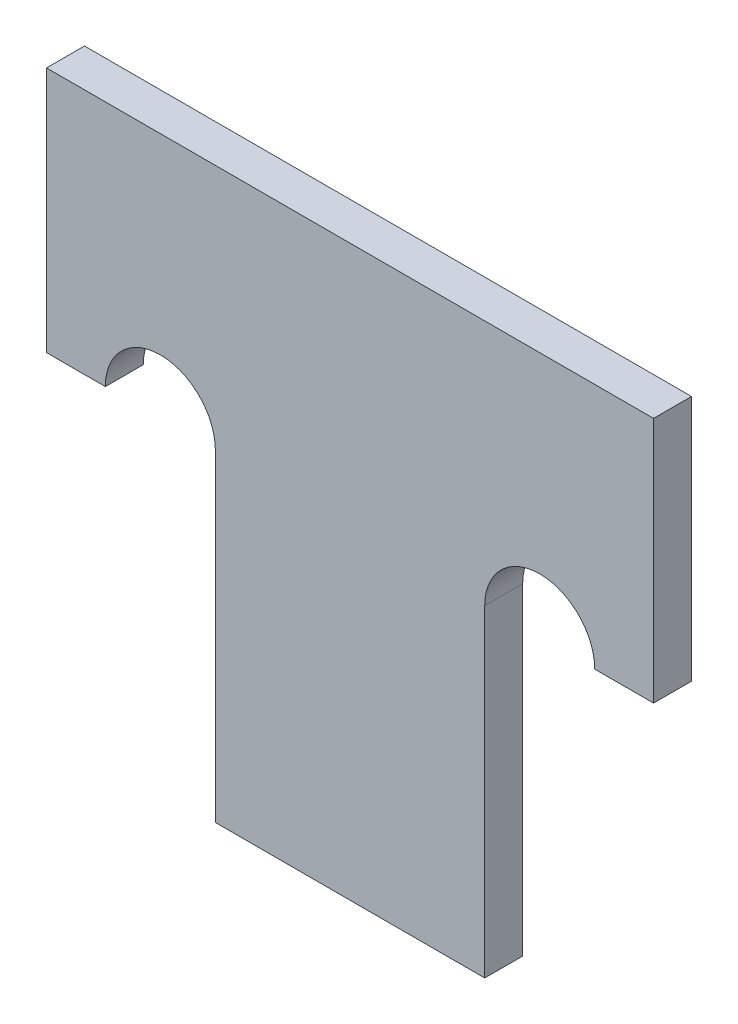
ISO-10303-21;
HEADER;
FILE_DESCRIPTION(('STEP AP214'),'2;1');
FILE_NAME('part.step','',(''),(''),'','','');
FILE_SCHEMA(('AUTOMOTIVE_DESIGN { 1 0 10303 214 1 1 1 1 }'));
ENDSEC;
DATA;
#1=APPLICATION_CONTEXT('core data for automotive mechanical design processes');
#2=APPLICATION_PROTOCOL_DEFINITION('international standard','automotive_design',2000,#1);
#3=PRODUCT_CONTEXT('',#1,'mechanical');
#4=PRODUCT('Part','Part','',(#3));
#5=PRODUCT_RELATED_PRODUCT_CATEGORY('part','',(#4));
#6=PRODUCT_DEFINITION_FORMATION('','',#4);
#7=PRODUCT_DEFINITION_CONTEXT('part definition',#1,'design');
#8=PRODUCT_DEFINITION('design','',#6,#7);
#9=PRODUCT_DEFINITION_SHAPE('','',#8);
#10=(LENGTH_UNIT() NAMED_UNIT(*) SI_UNIT(.MILLI.,.METRE.));
#11=(NAMED_UNIT(*) PLANE_ANGLE_UNIT() SI_UNIT($,.RADIAN.));
#12=(NAMED_UNIT(*) SI_UNIT($,.STERADIAN.) SOLID_ANGLE_UNIT());
#13=UNCERTAINTY_MEASURE_WITH_UNIT(LENGTH_MEASURE(1.E-05),#10,'distance_accuracy_value','');
#14=(GEOMETRIC_REPRESENTATION_CONTEXT(3) GLOBAL_UNCERTAINTY_ASSIGNED_CONTEXT((#13)) GLOBAL_UNIT_ASSIGNED_CONTEXT((#10,
#11,#12)) REPRESENTATION_CONTEXT('',''));
#15=CARTESIAN_POINT('',(0.,0.,0.));
#16=DIRECTION('',(0.,0.,1.));
#17=DIRECTION('',(1.,0.,0.));
#18=AXIS2_PLACEMENT_3D('',#15,#16,#17);
#19=CARTESIAN_POINT('',(0.,0.,2.54));
#20=DIRECTION('',(0.,0.,-1.));
#21=DIRECTION('',(-1.,0.,0.));
#22=AXIS2_PLACEMENT_3D('',#19,#20,#21);
#23=PLANE('',#22);
#24=DIRECTION('',(1.,0.,0.));
#25=VECTOR('',#24,1.);
#26=CARTESIAN_POINT('',(16.383,2.54,2.54));
#27=LINE('',#26,#25);
#28=CARTESIAN_POINT('',(16.383,2.54,2.54));
#29=VERTEX_POINT('',#28);
#30=CARTESIAN_POINT('',(20.32,2.54,2.54));
#31=VERTEX_POINT('',#30);
#32=EDGE_CURVE('E122',#29,#31,#27,.T.);
#33=ORIENTED_EDGE('',*,*,#32,.T.);
#34=DIRECTION('',(0.,1.,0.));
#35=VECTOR('',#34,1.);
#36=CARTESIAN_POINT('',(20.32,-19.05,2.54));
#37=LINE('',#36,#35);
#38=CARTESIAN_POINT('',(20.32,19.05,2.54));
#39=VERTEX_POINT('',#38);
#40=EDGE_CURVE('E172',#31,#39,#37,.T.);
#41=ORIENTED_EDGE('',*,*,#40,.T.);
#42=DIRECTION('',(-1.,0.,0.));
#43=VECTOR('',#42,1.);
#44=CARTESIAN_POINT('',(-20.32,19.05,2.54));
#45=LINE('',#44,#43);
#46=CARTESIAN_POINT('',(-20.32,19.05,2.54));
#47=VERTEX_POINT('',#46);
#48=EDGE_CURVE('E174',#39,#47,#45,.T.);
#49=ORIENTED_EDGE('',*,*,#48,.T.);
#50=DIRECTION('',(0.,-1.,0.));
#51=VECTOR('',#50,1.);
#52=CARTESIAN_POINT('',(-20.32,-19.05,2.54));
#53=LINE('',#52,#51);
#54=CARTESIAN_POINT('',(-20.32,2.54,2.54));
#55=VERTEX_POINT('',#54);
#56=EDGE_CURVE('E177',#47,#55,#53,.T.);
#57=ORIENTED_EDGE('',*,*,#56,.T.);
#58=DIRECTION('',(1.,0.,0.));
#59=VECTOR('',#58,1.);
#60=CARTESIAN_POINT('',(-16.383,2.54,2.54));
#61=LINE('',#60,#59);
#62=CARTESIAN_POINT('',(-16.383,2.54,2.54));
#63=VERTEX_POINT('',#62);
#64=EDGE_CURVE('E153',#55,#63,#61,.T.);
#65=ORIENTED_EDGE('',*,*,#64,.T.);
#66=CARTESIAN_POINT('',(-12.7,2.54,2.54));
#67=DIRECTION('',(0.,0.,-1.));
#68=DIRECTION('',(-1.,0.,0.));
#69=AXIS2_PLACEMENT_3D('',#66,#67,#68);
#70=CIRCLE('',#69,3.683);
#71=CARTESIAN_POINT('',(-9.017,2.54,2.54));
#72=VERTEX_POINT('',#71);
#73=EDGE_CURVE('E138',#63,#72,#70,.T.);
#74=ORIENTED_EDGE('',*,*,#73,.T.);
#75=DIRECTION('',(0.,-1.,0.));
#76=VECTOR('',#75,1.);
#77=CARTESIAN_POINT('',(-9.017,2.54,2.54));
#78=LINE('',#77,#76);
#79=CARTESIAN_POINT('',(-9.017,-19.05,2.54));
#80=VERTEX_POINT('',#79);
#81=EDGE_CURVE('E135',#72,#80,#78,.T.);
#82=ORIENTED_EDGE('',*,*,#81,.T.);
#83=DIRECTION('',(1.,0.,0.));
#84=VECTOR('',#83,1.);
#85=CARTESIAN_POINT('',(-20.32,-19.05,2.54));
#86=LINE('',#85,#84);
#87=CARTESIAN_POINT('',(9.017,-19.05,2.54));
#88=VERTEX_POINT('',#87);
#89=EDGE_CURVE('E180',#80,#88,#86,.T.);
#90=ORIENTED_EDGE('',*,*,#89,.T.);
#91=DIRECTION('',(0.,1.,0.));
#92=VECTOR('',#91,1.);
#93=CARTESIAN_POINT('',(9.017,2.54,2.54));
#94=LINE('',#93,#92);
#95=CARTESIAN_POINT('',(9.017,2.54,2.54));
#96=VERTEX_POINT('',#95);
#97=EDGE_CURVE('E51',#88,#96,#94,.T.);
#98=ORIENTED_EDGE('',*,*,#97,.T.);
#99=CARTESIAN_POINT('',(12.7,2.54,2.54));
#100=DIRECTION('',(0.,0.,-1.));
#101=DIRECTION('',(-1.,0.,0.));
#102=AXIS2_PLACEMENT_3D('',#99,#100,#101);
#103=CIRCLE('',#102,3.683);
#104=EDGE_CURVE('E121',#96,#29,#103,.T.);
#105=ORIENTED_EDGE('',*,*,#104,.T.);
#106=EDGE_LOOP('',(#33,#41,#49,#57,#65,#74,#82,#90,#98,#105));
#107=FACE_BOUND('',#106,.T.);
#108=ADVANCED_FACE('F36',(#107),#23,.F.);
#109=CARTESIAN_POINT('',(0.,0.,0.));
#110=DIRECTION('',(0.,0.,-1.));
#111=DIRECTION('',(-1.,0.,0.));
#112=AXIS2_PLACEMENT_3D('',#109,#110,#111);
#113=PLANE('',#112);
#114=DIRECTION('',(0.,1.,0.));
#115=VECTOR('',#114,1.);
#116=CARTESIAN_POINT('',(20.32,-19.05,0.));
#117=LINE('',#116,#115);
#118=CARTESIAN_POINT('',(20.32,2.54,0.));
#119=VERTEX_POINT('',#118);
#120=CARTESIAN_POINT('',(20.32,19.05,0.));
#121=VERTEX_POINT('',#120);
#122=EDGE_CURVE('E183',#119,#121,#117,.T.);
#123=ORIENTED_EDGE('',*,*,#122,.F.);
#124=DIRECTION('',(-1.,0.,0.));
#125=VECTOR('',#124,1.);
#126=CARTESIAN_POINT('',(16.383,2.54,0.));
#127=LINE('',#126,#125);
#128=CARTESIAN_POINT('',(16.383,2.54,0.));
#129=VERTEX_POINT('',#128);
#130=EDGE_CURVE('E131',#119,#129,#127,.T.);
#131=ORIENTED_EDGE('',*,*,#130,.T.);
#132=CARTESIAN_POINT('',(12.7,2.54,0.));
#133=DIRECTION('',(0.,0.,1.));
#134=DIRECTION('',(1.,0.,0.));
#135=AXIS2_PLACEMENT_3D('',#132,#133,#134);
#136=CIRCLE('',#135,3.683);
#137=CARTESIAN_POINT('',(9.017,2.54,0.));
#138=VERTEX_POINT('',#137);
#139=EDGE_CURVE('E118',#129,#138,#136,.T.);
#140=ORIENTED_EDGE('',*,*,#139,.T.);
#141=DIRECTION('',(0.,-1.,0.));
#142=VECTOR('',#141,1.);
#143=CARTESIAN_POINT('',(9.017,2.54,0.));
#144=LINE('',#143,#142);
#145=CARTESIAN_POINT('',(9.017,-19.05,0.));
#146=VERTEX_POINT('',#145);
#147=EDGE_CURVE('E126',#138,#146,#144,.T.);
#148=ORIENTED_EDGE('',*,*,#147,.T.);
#149=DIRECTION('',(1.,0.,0.));
#150=VECTOR('',#149,1.);
#151=CARTESIAN_POINT('',(-20.32,-19.05,0.));
#152=LINE('',#151,#150);
#153=CARTESIAN_POINT('',(-9.017,-19.05,0.));
#154=VERTEX_POINT('',#153);
#155=EDGE_CURVE('E175',#154,#146,#152,.T.);
#156=ORIENTED_EDGE('',*,*,#155,.F.);
#157=DIRECTION('',(0.,1.,0.));
#158=VECTOR('',#157,1.);
#159=CARTESIAN_POINT('',(-9.017,2.54,0.));
#160=LINE('',#159,#158);
#161=CARTESIAN_POINT('',(-9.017,2.54,0.));
#162=VERTEX_POINT('',#161);
#163=EDGE_CURVE('E59',#154,#162,#160,.T.);
#164=ORIENTED_EDGE('',*,*,#163,.T.);
#165=CARTESIAN_POINT('',(-12.7,2.54,0.));
#166=DIRECTION('',(0.,0.,1.));
#167=DIRECTION('',(-1.,0.,0.));
#168=AXIS2_PLACEMENT_3D('',#165,#166,#167);
#169=CIRCLE('',#168,3.683);
#170=CARTESIAN_POINT('',(-16.383,2.54,0.));
#171=VERTEX_POINT('',#170);
#172=EDGE_CURVE('E156',#162,#171,#169,.T.);
#173=ORIENTED_EDGE('',*,*,#172,.T.);
#174=DIRECTION('',(-1.,0.,0.));
#175=VECTOR('',#174,1.);
#176=CARTESIAN_POINT('',(-16.383,2.54,0.));
#177=LINE('',#176,#175);
#178=CARTESIAN_POINT('',(-20.32,2.54,0.));
#179=VERTEX_POINT('',#178);
#180=EDGE_CURVE('E159',#171,#179,#177,.T.);
#181=ORIENTED_EDGE('',*,*,#180,.T.);
#182=DIRECTION('',(0.,-1.,0.));
#183=VECTOR('',#182,1.);
#184=CARTESIAN_POINT('',(-20.32,-19.05,0.));
#185=LINE('',#184,#183);
#186=CARTESIAN_POINT('',(-20.32,19.05,0.));
#187=VERTEX_POINT('',#186);
#188=EDGE_CURVE('E187',#187,#179,#185,.T.);
#189=ORIENTED_EDGE('',*,*,#188,.F.);
#190=DIRECTION('',(-1.,0.,0.));
#191=VECTOR('',#190,1.);
#192=CARTESIAN_POINT('',(-20.32,19.05,0.));
#193=LINE('',#192,#191);
#194=EDGE_CURVE('E185',#121,#187,#193,.T.);
#195=ORIENTED_EDGE('',*,*,#194,.F.);
#196=EDGE_LOOP('',(#123,#131,#140,#148,#156,#164,#173,#181,#189,#195));
#197=FACE_BOUND('',#196,.T.);
#198=ADVANCED_FACE('F134',(#197),#113,.T.);
#199=CARTESIAN_POINT('',(20.32,-19.05,2.54));
#200=DIRECTION('',(-1.,0.,0.));
#201=DIRECTION('',(0.,-1.,0.));
#202=AXIS2_PLACEMENT_3D('',#199,#200,#201);
#203=PLANE('',#202);
#204=DIRECTION('',(0.,0.,-1.));
#205=VECTOR('',#204,1.);
#206=CARTESIAN_POINT('',(20.32,2.54,30.2254174250633));
#207=LINE('',#206,#205);
#208=EDGE_CURVE('E146',#31,#119,#207,.T.);
#209=ORIENTED_EDGE('',*,*,#208,.T.);
#210=ORIENTED_EDGE('',*,*,#122,.T.);
#211=DIRECTION('',(0.,0.,-1.));
#212=VECTOR('',#211,1.);
#213=CARTESIAN_POINT('',(20.32,19.05,2.54));
#214=LINE('',#213,#212);
#215=EDGE_CURVE('E11',#39,#121,#214,.T.);
#216=ORIENTED_EDGE('',*,*,#215,.F.);
#217=ORIENTED_EDGE('',*,*,#40,.F.);
#218=EDGE_LOOP('',(#209,#210,#216,#217));
#219=FACE_BOUND('',#218,.T.);
#220=ADVANCED_FACE('F38',(#219),#203,.F.);
#221=CARTESIAN_POINT('',(-20.32,-19.05,2.54));
#222=DIRECTION('',(1.,0.,0.));
#223=DIRECTION('',(0.,1.,0.));
#224=AXIS2_PLACEMENT_3D('',#221,#222,#223);
#225=PLANE('',#224);
#226=DIRECTION('',(0.,0.,-1.));
#227=VECTOR('',#226,1.);
#228=CARTESIAN_POINT('',(-20.32,2.54,30.2254174250633));
#229=LINE('',#228,#227);
#230=EDGE_CURVE('E162',#55,#179,#229,.T.);
#231=ORIENTED_EDGE('',*,*,#230,.F.);
#232=ORIENTED_EDGE('',*,*,#56,.F.);
#233=DIRECTION('',(0.,0.,-1.));
#234=VECTOR('',#233,1.);
#235=CARTESIAN_POINT('',(-20.32,19.05,2.54));
#236=LINE('',#235,#234);
#237=EDGE_CURVE('E44',#47,#187,#236,.T.);
#238=ORIENTED_EDGE('',*,*,#237,.T.);
#239=ORIENTED_EDGE('',*,*,#188,.T.);
#240=EDGE_LOOP('',(#231,#232,#238,#239));
#241=FACE_BOUND('',#240,.T.);
#242=ADVANCED_FACE('F196',(#241),#225,.F.);
#243=CARTESIAN_POINT('',(-20.32,-19.05,2.54));
#244=DIRECTION('',(0.,1.,0.));
#245=DIRECTION('',(-1.,0.,0.));
#246=AXIS2_PLACEMENT_3D('',#243,#244,#245);
#247=PLANE('',#246);
#248=DIRECTION('',(0.,0.,-1.));
#249=VECTOR('',#248,1.);
#250=CARTESIAN_POINT('',(9.017,-19.05,30.2254174250633));
#251=LINE('',#250,#249);
#252=EDGE_CURVE('E123',#88,#146,#251,.T.);
#253=ORIENTED_EDGE('',*,*,#252,.F.);
#254=ORIENTED_EDGE('',*,*,#89,.F.);
#255=DIRECTION('',(0.,0.,-1.));
#256=VECTOR('',#255,1.);
#257=CARTESIAN_POINT('',(-9.017,-19.05,30.2254174250633));
#258=LINE('',#257,#256);
#259=EDGE_CURVE('E168',#80,#154,#258,.T.);
#260=ORIENTED_EDGE('',*,*,#259,.T.);
#261=ORIENTED_EDGE('',*,*,#155,.T.);
#262=EDGE_LOOP('',(#253,#254,#260,#261));
#263=FACE_BOUND('',#262,.T.);
#264=ADVANCED_FACE('F214',(#263),#247,.F.);
#265=CARTESIAN_POINT('',(-20.32,19.05,2.54));
#266=DIRECTION('',(0.,-1.,0.));
#267=DIRECTION('',(0.,0.,-1.));
#268=AXIS2_PLACEMENT_3D('',#265,#266,#267);
#269=PLANE('',#268);
#270=ORIENTED_EDGE('',*,*,#194,.T.);
#271=ORIENTED_EDGE('',*,*,#237,.F.);
#272=ORIENTED_EDGE('',*,*,#48,.F.);
#273=ORIENTED_EDGE('',*,*,#215,.T.);
#274=EDGE_LOOP('',(#270,#271,#272,#273));
#275=FACE_BOUND('',#274,.T.);
#276=ADVANCED_FACE('F208',(#275),#269,.F.);
#277=CARTESIAN_POINT('',(-16.383,2.54,30.2254174250633));
#278=DIRECTION('',(0.,-1.,0.));
#279=DIRECTION('',(1.,0.,0.));
#280=AXIS2_PLACEMENT_3D('',#277,#278,#279);
#281=PLANE('',#280);
#282=ORIENTED_EDGE('',*,*,#230,.T.);
#283=ORIENTED_EDGE('',*,*,#180,.F.);
#284=DIRECTION('',(0.,0.,-1.));
#285=VECTOR('',#284,1.);
#286=CARTESIAN_POINT('',(-16.383,2.54,30.2254174250633));
#287=LINE('',#286,#285);
#288=EDGE_CURVE('E164',#63,#171,#287,.T.);
#289=ORIENTED_EDGE('',*,*,#288,.F.);
#290=ORIENTED_EDGE('',*,*,#64,.F.);
#291=EDGE_LOOP('',(#282,#283,#289,#290));
#292=FACE_BOUND('',#291,.T.);
#293=ADVANCED_FACE('F204',(#292),#281,.T.);
#294=CARTESIAN_POINT('',(-12.7,2.54,30.2254174250633));
#295=DIRECTION('',(0.,0.,-1.));
#296=DIRECTION('',(-1.,0.,0.));
#297=AXIS2_PLACEMENT_3D('',#294,#295,#296);
#298=CYLINDRICAL_SURFACE('',#297,3.683);
#299=ORIENTED_EDGE('',*,*,#288,.T.);
#300=ORIENTED_EDGE('',*,*,#172,.F.);
#301=DIRECTION('',(0.,0.,-1.));
#302=VECTOR('',#301,1.);
#303=CARTESIAN_POINT('',(-9.017,2.54,30.2254174250633));
#304=LINE('',#303,#302);
#305=EDGE_CURVE('E166',#72,#162,#304,.T.);
#306=ORIENTED_EDGE('',*,*,#305,.F.);
#307=ORIENTED_EDGE('',*,*,#73,.F.);
#308=EDGE_LOOP('',(#299,#300,#306,#307));
#309=FACE_BOUND('',#308,.T.);
#310=ADVANCED_FACE('F218',(#309),#298,.F.);
#311=CARTESIAN_POINT('',(-9.017,2.54,30.2254174250633));
#312=DIRECTION('',(-1.,0.,0.));
#313=DIRECTION('',(0.,-1.,0.));
#314=AXIS2_PLACEMENT_3D('',#311,#312,#313);
#315=PLANE('',#314);
#316=ORIENTED_EDGE('',*,*,#305,.T.);
#317=ORIENTED_EDGE('',*,*,#163,.F.);
#318=ORIENTED_EDGE('',*,*,#259,.F.);
#319=ORIENTED_EDGE('',*,*,#81,.F.);
#320=EDGE_LOOP('',(#316,#317,#318,#319));
#321=FACE_BOUND('',#320,.T.);
#322=ADVANCED_FACE('F215',(#321),#315,.T.);
#323=CARTESIAN_POINT('',(16.383,2.54,30.2254174250633));
#324=DIRECTION('',(0.,-1.,0.));
#325=DIRECTION('',(1.,0.,0.));
#326=AXIS2_PLACEMENT_3D('',#323,#324,#325);
#327=PLANE('',#326);
#328=DIRECTION('',(0.,0.,-1.));
#329=VECTOR('',#328,1.);
#330=CARTESIAN_POINT('',(16.383,2.54,30.2254174250633));
#331=LINE('',#330,#329);
#332=EDGE_CURVE('E144',#29,#129,#331,.T.);
#333=ORIENTED_EDGE('',*,*,#332,.T.);
#334=ORIENTED_EDGE('',*,*,#130,.F.);
#335=ORIENTED_EDGE('',*,*,#208,.F.);
#336=ORIENTED_EDGE('',*,*,#32,.F.);
#337=EDGE_LOOP('',(#333,#334,#335,#336));
#338=FACE_BOUND('',#337,.T.);
#339=ADVANCED_FACE('F211',(#338),#327,.T.);
#340=CARTESIAN_POINT('',(9.017,2.54,30.2254174250633));
#341=DIRECTION('',(1.,0.,0.));
#342=DIRECTION('',(0.,1.,0.));
#343=AXIS2_PLACEMENT_3D('',#340,#341,#342);
#344=PLANE('',#343);
#345=ORIENTED_EDGE('',*,*,#252,.T.);
#346=ORIENTED_EDGE('',*,*,#147,.F.);
#347=DIRECTION('',(0.,0.,-1.));
#348=VECTOR('',#347,1.);
#349=CARTESIAN_POINT('',(9.017,2.54,30.2254174250633));
#350=LINE('',#349,#348);
#351=EDGE_CURVE('E113',#96,#138,#350,.T.);
#352=ORIENTED_EDGE('',*,*,#351,.F.);
#353=ORIENTED_EDGE('',*,*,#97,.F.);
#354=EDGE_LOOP('',(#345,#346,#352,#353));
#355=FACE_BOUND('',#354,.T.);
#356=ADVANCED_FACE('F127',(#355),#344,.T.);
#357=CARTESIAN_POINT('',(12.7,2.54,30.2254174250633));
#358=DIRECTION('',(0.,0.,-1.));
#359=DIRECTION('',(-1.,0.,0.));
#360=AXIS2_PLACEMENT_3D('',#357,#358,#359);
#361=CYLINDRICAL_SURFACE('',#360,3.683);
#362=ORIENTED_EDGE('',*,*,#351,.T.);
#363=ORIENTED_EDGE('',*,*,#139,.F.);
#364=ORIENTED_EDGE('',*,*,#332,.F.);
#365=ORIENTED_EDGE('',*,*,#104,.F.);
#366=EDGE_LOOP('',(#362,#363,#364,#365));
#367=FACE_BOUND('',#366,.T.);
#368=ADVANCED_FACE('F115',(#367),#361,.F.);
#369=CLOSED_SHELL('',(#108,#198,#220,#242,#264,#276,#293,#310,#322,#339,#356,#368));
#370=MANIFOLD_SOLID_BREP('B2',#369);
#371=ADVANCED_BREP_SHAPE_REPRESENTATION('',(#18,#370),#14);
#372=SHAPE_DEFINITION_REPRESENTATION(#9,#371);
ENDSEC;
END-ISO-10303-21;
